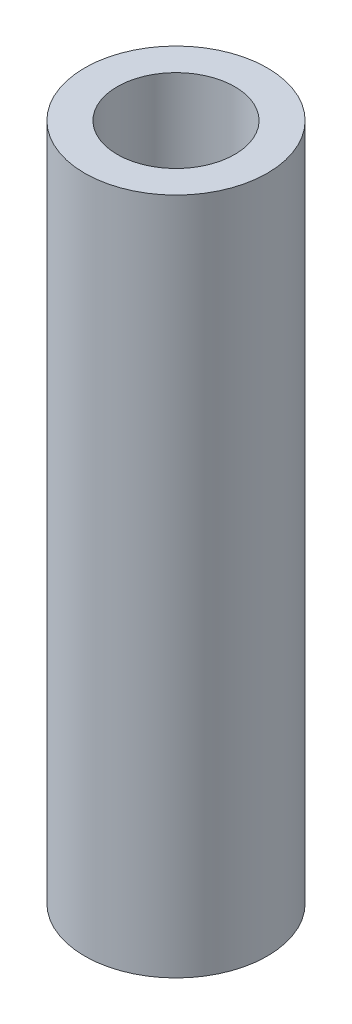
ISO-10303-21;
HEADER;
FILE_DESCRIPTION(('STEP AP214'),'2;1');
FILE_NAME('part.step','',(''),(''),'','','');
FILE_SCHEMA(('AUTOMOTIVE_DESIGN { 1 0 10303 214 1 1 1 1 }'));
ENDSEC;
DATA;
#1=APPLICATION_CONTEXT('core data for automotive mechanical design processes');
#2=APPLICATION_PROTOCOL_DEFINITION('international standard','automotive_design',2000,#1);
#3=PRODUCT_CONTEXT('',#1,'mechanical');
#4=PRODUCT('Part','Part','',(#3));
#5=PRODUCT_RELATED_PRODUCT_CATEGORY('part','',(#4));
#6=PRODUCT_DEFINITION_FORMATION('','',#4);
#7=PRODUCT_DEFINITION_CONTEXT('part definition',#1,'design');
#8=PRODUCT_DEFINITION('design','',#6,#7);
#9=PRODUCT_DEFINITION_SHAPE('','',#8);
#10=(LENGTH_UNIT() NAMED_UNIT(*) SI_UNIT(.MILLI.,.METRE.));
#11=(NAMED_UNIT(*) PLANE_ANGLE_UNIT() SI_UNIT($,.RADIAN.));
#12=(NAMED_UNIT(*) SI_UNIT($,.STERADIAN.) SOLID_ANGLE_UNIT());
#13=UNCERTAINTY_MEASURE_WITH_UNIT(LENGTH_MEASURE(1.E-05),#10,'distance_accuracy_value','');
#14=(GEOMETRIC_REPRESENTATION_CONTEXT(3) GLOBAL_UNCERTAINTY_ASSIGNED_CONTEXT((#13)) GLOBAL_UNIT_ASSIGNED_CONTEXT((#10,
#11,#12)) REPRESENTATION_CONTEXT('',''));
#15=CARTESIAN_POINT('',(0.,0.,0.));
#16=DIRECTION('',(0.,0.,1.));
#17=DIRECTION('',(1.,0.,0.));
#18=AXIS2_PLACEMENT_3D('',#15,#16,#17);
#19=CARTESIAN_POINT('',(0.,75.,0.));
#20=DIRECTION('',(0.,1.,0.));
#21=DIRECTION('',(0.,0.,1.));
#22=AXIS2_PLACEMENT_3D('',#19,#20,#21);
#23=PLANE('',#22);
#24=CARTESIAN_POINT('',(0.,75.,0.));
#25=DIRECTION('',(0.,1.,0.));
#26=DIRECTION('',(0.,0.,1.));
#27=AXIS2_PLACEMENT_3D('',#24,#25,#26);
#28=CIRCLE('',#27,10.1);
#29=CARTESIAN_POINT('',(0.,75.,10.1));
#30=VERTEX_POINT('',#29);
#31=EDGE_CURVE('E10',#30,#30,#28,.T.);
#32=ORIENTED_EDGE('',*,*,#31,.T.);
#33=EDGE_LOOP('',(#32));
#34=FACE_BOUND('',#33,.T.);
#35=CARTESIAN_POINT('',(0.,75.,0.));
#36=DIRECTION('',(0.,1.,0.));
#37=DIRECTION('',(0.,0.,1.));
#38=AXIS2_PLACEMENT_3D('',#35,#36,#37);
#39=CIRCLE('',#38,6.5);
#40=CARTESIAN_POINT('',(0.,75.,6.5));
#41=VERTEX_POINT('',#40);
#42=EDGE_CURVE('E42',#41,#41,#39,.T.);
#43=ORIENTED_EDGE('',*,*,#42,.F.);
#44=EDGE_LOOP('',(#43));
#45=FACE_BOUND('',#44,.T.);
#46=ADVANCED_FACE('F31',(#34,#45),#23,.T.);
#47=CARTESIAN_POINT('',(0.,0.,0.));
#48=DIRECTION('',(0.,1.,0.));
#49=DIRECTION('',(0.,0.,1.));
#50=AXIS2_PLACEMENT_3D('',#47,#48,#49);
#51=PLANE('',#50);
#52=CARTESIAN_POINT('',(0.,0.,0.));
#53=DIRECTION('',(0.,1.,0.));
#54=DIRECTION('',(0.,0.,1.));
#55=AXIS2_PLACEMENT_3D('',#52,#53,#54);
#56=CIRCLE('',#55,10.1);
#57=CARTESIAN_POINT('',(0.,0.,10.1));
#58=VERTEX_POINT('',#57);
#59=EDGE_CURVE('E35',#58,#58,#56,.T.);
#60=ORIENTED_EDGE('',*,*,#59,.F.);
#61=EDGE_LOOP('',(#60));
#62=FACE_BOUND('',#61,.T.);
#63=CARTESIAN_POINT('',(0.,0.,0.));
#64=DIRECTION('',(0.,1.,0.));
#65=DIRECTION('',(0.,0.,1.));
#66=AXIS2_PLACEMENT_3D('',#63,#64,#65);
#67=CIRCLE('',#66,6.5);
#68=CARTESIAN_POINT('',(0.,0.,6.5));
#69=VERTEX_POINT('',#68);
#70=EDGE_CURVE('E44',#69,#69,#67,.T.);
#71=ORIENTED_EDGE('',*,*,#70,.T.);
#72=EDGE_LOOP('',(#71));
#73=FACE_BOUND('',#72,.T.);
#74=ADVANCED_FACE('F54',(#62,#73),#51,.F.);
#75=CARTESIAN_POINT('',(0.,75.,0.));
#76=DIRECTION('',(0.,-1.,0.));
#77=DIRECTION('',(0.,0.,-1.));
#78=AXIS2_PLACEMENT_3D('',#75,#76,#77);
#79=CYLINDRICAL_SURFACE('',#78,10.1);
#80=ORIENTED_EDGE('',*,*,#31,.F.);
#81=EDGE_LOOP('',(#80));
#82=FACE_BOUND('',#81,.T.);
#83=ORIENTED_EDGE('',*,*,#59,.T.);
#84=EDGE_LOOP('',(#83));
#85=FACE_BOUND('',#84,.T.);
#86=ADVANCED_FACE('F33',(#82,#85),#79,.T.);
#87=CARTESIAN_POINT('',(0.,75.,0.));
#88=DIRECTION('',(0.,-1.,0.));
#89=DIRECTION('',(0.,0.,-1.));
#90=AXIS2_PLACEMENT_3D('',#87,#88,#89);
#91=CYLINDRICAL_SURFACE('',#90,6.5);
#92=ORIENTED_EDGE('',*,*,#42,.T.);
#93=EDGE_LOOP('',(#92));
#94=FACE_BOUND('',#93,.T.);
#95=ORIENTED_EDGE('',*,*,#70,.F.);
#96=EDGE_LOOP('',(#95));
#97=FACE_BOUND('',#96,.T.);
#98=ADVANCED_FACE('F50',(#94,#97),#91,.F.);
#99=CLOSED_SHELL('',(#46,#74,#86,#98));
#100=MANIFOLD_SOLID_BREP('B2',#99);
#101=ADVANCED_BREP_SHAPE_REPRESENTATION('',(#18,#100),#14);
#102=SHAPE_DEFINITION_REPRESENTATION(#9,#101);
ENDSEC;
END-ISO-10303-21;
